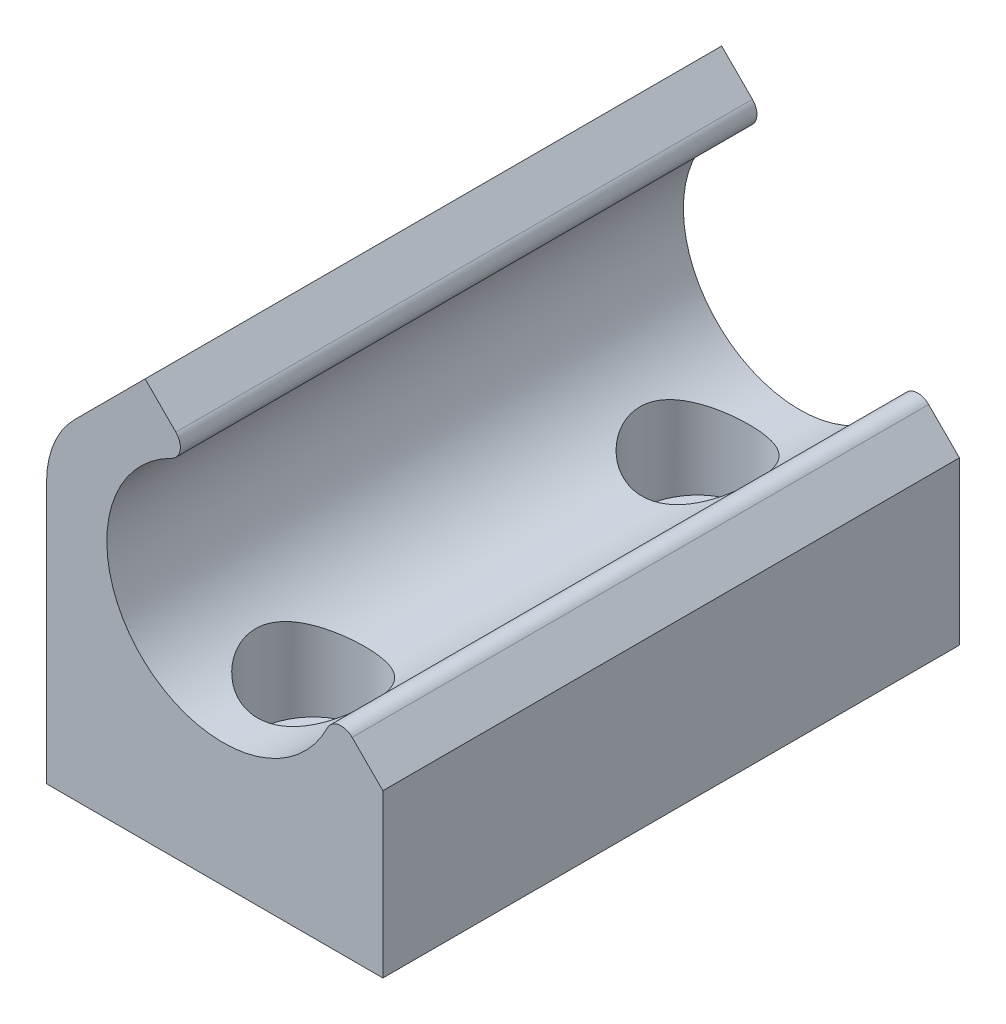
ISO-10303-21;
HEADER;
FILE_DESCRIPTION(('STEP AP214'),'2;1');
FILE_NAME('part.step','',(''),(''),'','','');
FILE_SCHEMA(('AUTOMOTIVE_DESIGN { 1 0 10303 214 1 1 1 1 }'));
ENDSEC;
DATA;
#1=APPLICATION_CONTEXT('core data for automotive mechanical design processes');
#2=APPLICATION_PROTOCOL_DEFINITION('international standard','automotive_design',2000,#1);
#3=PRODUCT_CONTEXT('',#1,'mechanical');
#4=PRODUCT('Part','Part','',(#3));
#5=PRODUCT_RELATED_PRODUCT_CATEGORY('part','',(#4));
#6=PRODUCT_DEFINITION_FORMATION('','',#4);
#7=PRODUCT_DEFINITION_CONTEXT('part definition',#1,'design');
#8=PRODUCT_DEFINITION('design','',#6,#7);
#9=PRODUCT_DEFINITION_SHAPE('','',#8);
#10=(LENGTH_UNIT() NAMED_UNIT(*) SI_UNIT(.MILLI.,.METRE.));
#11=(NAMED_UNIT(*) PLANE_ANGLE_UNIT() SI_UNIT($,.RADIAN.));
#12=(NAMED_UNIT(*) SI_UNIT($,.STERADIAN.) SOLID_ANGLE_UNIT());
#13=UNCERTAINTY_MEASURE_WITH_UNIT(LENGTH_MEASURE(1.E-05),#10,'distance_accuracy_value','');
#14=(GEOMETRIC_REPRESENTATION_CONTEXT(3) GLOBAL_UNCERTAINTY_ASSIGNED_CONTEXT((#13)) GLOBAL_UNIT_ASSIGNED_CONTEXT((#10,
#11,#12)) REPRESENTATION_CONTEXT('',''));
#15=CARTESIAN_POINT('',(0.,0.,0.));
#16=DIRECTION('',(0.,0.,1.));
#17=DIRECTION('',(1.,0.,0.));
#18=AXIS2_PLACEMENT_3D('',#15,#16,#17);
#19=CARTESIAN_POINT('',(9.1857781045255,12.4974390727315,30.));
#20=DIRECTION('',(0.,0.,-1.));
#21=DIRECTION('',(-1.,0.,0.));
#22=AXIS2_PLACEMENT_3D('',#19,#20,#21);
#23=CYLINDRICAL_SURFACE('',#22,6.05);
#24=CARTESIAN_POINT('',(9.1857781045255,12.4974390727315,30.));
#25=DIRECTION('',(0.,0.,-1.));
#26=DIRECTION('',(-1.,0.,0.));
#27=AXIS2_PLACEMENT_3D('',#24,#25,#26);
#28=CIRCLE('',#27,6.05);
#29=CARTESIAN_POINT('',(14.6152124653708,9.82840506746424,30.));
#30=VERTEX_POINT('',#29);
#31=CARTESIAN_POINT('',(6.51674409925826,17.9268734335767,30.));
#32=VERTEX_POINT('',#31);
#33=EDGE_CURVE('E212',#30,#32,#28,.T.);
#34=ORIENTED_EDGE('',*,*,#33,.F.);
#35=DIRECTION('',(0.,0.,-1.));
#36=VECTOR('',#35,1.);
#37=CARTESIAN_POINT('',(14.6152124653708,9.82840506746424,30.));
#38=LINE('',#37,#36);
#39=CARTESIAN_POINT('',(14.6152124653708,9.82840506746424,0.));
#40=VERTEX_POINT('',#39);
#41=EDGE_CURVE('E137',#30,#40,#38,.T.);
#42=ORIENTED_EDGE('',*,*,#41,.T.);
#43=CARTESIAN_POINT('',(9.1857781045255,12.4974390727315,0.));
#44=DIRECTION('',(0.,0.,-1.));
#45=DIRECTION('',(-1.,0.,0.));
#46=AXIS2_PLACEMENT_3D('',#43,#44,#45);
#47=CIRCLE('',#46,6.05);
#48=CARTESIAN_POINT('',(6.51674409925826,17.9268734335767,0.));
#49=VERTEX_POINT('',#48);
#50=EDGE_CURVE('E231',#40,#49,#47,.T.);
#51=ORIENTED_EDGE('',*,*,#50,.T.);
#52=DIRECTION('',(0.,0.,-1.));
#53=VECTOR('',#52,1.);
#54=CARTESIAN_POINT('',(6.51674409925826,17.9268734335767,30.));
#55=LINE('',#54,#53);
#56=EDGE_CURVE('E135',#49,#32,#55,.F.);
#57=ORIENTED_EDGE('',*,*,#56,.T.);
#58=EDGE_LOOP('',(#34,#42,#51,#57));
#59=FACE_BOUND('',#58,.T.);
#60=CARTESIAN_POINT('',(8.87549528494813,6.45540095866142,28.));
#61=CARTESIAN_POINT('',(9.03139950122602,6.44740435624747,27.9999884682132));
#62=CARTESIAN_POINT('',(9.18779808214235,6.44547694814391,27.9877768449764));
#63=CARTESIAN_POINT('',(9.49662535559507,6.45344673263324,27.939170372275));
#64=CARTESIAN_POINT('',(9.64904699591284,6.46336364166569,27.9027352443801));
#65=CARTESIAN_POINT('',(9.94496611693315,6.49342498274608,27.8071919153995));
#66=CARTESIAN_POINT('',(10.0884903727129,6.51353687169971,27.7481560034838));
#67=CARTESIAN_POINT('',(10.3636691682537,6.56156402023977,27.6094261179907));
#68=CARTESIAN_POINT('',(10.4953240499643,6.5894790549271,27.5297327397992));
#69=CARTESIAN_POINT('',(10.7502788587051,6.65168073659721,27.3475349797805));
#70=CARTESIAN_POINT('',(10.8728583994436,6.68621169164239,27.2441078185814));
#71=CARTESIAN_POINT('',(11.09984891244,6.75696914277472,27.019354128965));
#72=CARTESIAN_POINT('',(11.2042489267968,6.79319664489608,26.8980168859025));
#73=CARTESIAN_POINT('',(11.3998914951163,6.86610517699903,26.6300252938702));
#74=CARTESIAN_POINT('',(11.4895348563626,6.90261208430558,26.4821485884913));
#75=CARTESIAN_POINT('',(11.642570867745,6.96809560750674,26.1718295053516));
#76=CARTESIAN_POINT('',(11.705973996028,6.99707522744344,26.0093929731479));
#77=CARTESIAN_POINT('',(11.8021735069858,7.04219106759068,25.6803361510441));
#78=CARTESIAN_POINT('',(11.8359836555846,7.05874965271986,25.5140734029774));
#79=CARTESIAN_POINT('',(11.8750191615476,7.07793758194683,25.1774857684325));
#80=CARTESIAN_POINT('',(11.8802668062833,7.08057778653051,25.0071641533644));
#81=CARTESIAN_POINT('',(11.8628181806249,7.07194410347054,24.6845307256137));
#82=CARTESIAN_POINT('',(11.8427096597932,7.06195848980425,24.5320348069978));
#83=CARTESIAN_POINT('',(11.7797850452715,7.03165161456526,24.2328784775741));
#84=CARTESIAN_POINT('',(11.7369634520435,7.01132784985495,24.0862194893175));
#85=CARTESIAN_POINT('',(11.6294066801047,6.96257784291409,23.8001301326586));
#86=CARTESIAN_POINT('',(11.5643565085781,6.93403611706231,23.6608389008156));
#87=CARTESIAN_POINT('',(11.4143686578002,6.87227669636158,23.3945404094432));
#88=CARTESIAN_POINT('',(11.3294224796463,6.83905700566895,23.2675384323227));
#89=CARTESIAN_POINT('',(11.1321835410953,6.76803884667236,23.0162369263696));
#90=CARTESIAN_POINT('',(11.0180211402644,6.73011170622754,22.8934362407789));
#91=CARTESIAN_POINT('',(10.7703027638599,6.65719569775622,22.6681023647629));
#92=CARTESIAN_POINT('',(10.6367412657133,6.62220767093421,22.5655749654693));
#93=CARTESIAN_POINT('',(10.3495689921729,6.5585656625862,22.3814335797287));
#94=CARTESIAN_POINT('',(10.1955448033763,6.53008928656067,22.3003980892383));
#95=CARTESIAN_POINT('',(9.87436477748037,6.48457200110711,22.1658315230099));
#96=CARTESIAN_POINT('',(9.70721906756909,6.46752236759392,22.1122794715607));
#97=CARTESIAN_POINT('',(9.37916590008335,6.44848132739527,22.0381974626905));
#98=CARTESIAN_POINT('',(9.21884562249271,6.44538452891219,22.0153489461199));
#99=CARTESIAN_POINT('',(8.89691648037471,6.4521976626231,21.9957495066285));
#100=CARTESIAN_POINT('',(8.73530804581879,6.46210342170024,21.9989902121935));
#101=CARTESIAN_POINT('',(8.42541232444363,6.49350730342819,22.03010813462));
#102=CARTESIAN_POINT('',(8.27690059816906,6.51428933887078,22.056525112841));
#103=CARTESIAN_POINT('',(7.98707655238687,6.56555164683525,22.1306622206776));
#104=CARTESIAN_POINT('',(7.84576543698287,6.59603353525585,22.1783859003115));
#105=CARTESIAN_POINT('',(7.56697382975104,6.66617884046379,22.2959802836046));
#106=CARTESIAN_POINT('',(7.42997784087949,6.70620359865459,22.3667784978471));
#107=CARTESIAN_POINT('',(7.16956518845382,6.79163507559249,22.5275013347356));
#108=CARTESIAN_POINT('',(7.04615506229741,6.83704436368767,22.6174351047282));
#109=CARTESIAN_POINT('',(6.80229039905101,6.93501560243133,22.82510855536));
#110=CARTESIAN_POINT('',(6.68359123576775,6.98782068093557,22.9448013555173));
#111=CARTESIAN_POINT('',(6.46736656834592,7.09122710993321,23.2029657019698));
#112=CARTESIAN_POINT('',(6.3698587683695,7.14182658978099,23.3414527941189));
#113=CARTESIAN_POINT('',(6.19494795202944,7.23741776699546,23.6413398023546));
#114=CARTESIAN_POINT('',(6.11857926206208,7.2820784294398,23.8034648394267));
#115=CARTESIAN_POINT('',(6.02617872039569,7.33791204694234,24.0568649344285));
#116=CARTESIAN_POINT('',(5.99907408067541,7.35466128009003,24.1430140441605));
#117=CARTESIAN_POINT('',(5.95261318254559,7.38374170477447,24.3181288589389));
#118=CARTESIAN_POINT('',(5.9332552371456,7.39607385815311,24.4070939461937));
#119=CARTESIAN_POINT('',(5.90457256610746,7.41448306829454,24.5757365720437));
#120=CARTESIAN_POINT('',(5.89429824134949,7.42114804847093,24.6551901540139));
#121=CARTESIAN_POINT('',(5.88013863406065,7.43035706295575,24.814898591548));
#122=CARTESIAN_POINT('',(5.87625250893076,7.4329016407417,24.8951533400336));
#123=CARTESIAN_POINT('',(5.87493923433004,7.43375976439539,25.0557137543537));
#124=CARTESIAN_POINT('',(5.87750981964802,7.43207479411788,25.1360193924524));
#125=CARTESIAN_POINT('',(5.88905071700072,7.42455734069398,25.2959495605022));
#126=CARTESIAN_POINT('',(5.89802074755596,7.41872503996786,25.3755741202548));
#127=CARTESIAN_POINT('',(5.9315876511128,7.39710218152119,25.5944743643302));
#128=CARTESIAN_POINT('',(5.96290174999751,7.3771001838947,25.7323706845501));
#129=CARTESIAN_POINT('',(6.0438194705235,7.32706003019278,26.000652593341));
#130=CARTESIAN_POINT('',(6.09342921786011,7.29701851303135,26.1310356494178));
#131=CARTESIAN_POINT('',(6.2140911613304,7.2270670027082,26.3926050806416));
#132=CARTESIAN_POINT('',(6.28657939839812,7.18654559224073,26.5229629488515));
#133=CARTESIAN_POINT('',(6.44915917513535,7.10097248772729,26.7705530207602));
#134=CARTESIAN_POINT('',(6.53926060567717,7.05591825515936,26.8877777909743));
#135=CARTESIAN_POINT('',(6.75022416905689,6.95793928049711,27.1241368962574));
#136=CARTESIAN_POINT('',(6.87367521154988,6.9048508984646,27.2409012101503));
#137=CARTESIAN_POINT('',(7.1396155368062,6.80217882073999,27.452668857923));
#138=CARTESIAN_POINT('',(7.2821189939908,6.75259777680563,27.5476558458985));
#139=CARTESIAN_POINT('',(7.5099657180754,6.68359872877432,27.6726669562825));
#140=CARTESIAN_POINT('',(7.58950715245339,6.66121526915528,27.7118533633208));
#141=CARTESIAN_POINT('',(7.75232825978302,6.61910817244812,27.7832327540107));
#142=CARTESIAN_POINT('',(7.83560609394893,6.59938324575075,27.8154291330698));
#143=CARTESIAN_POINT('',(8.00512817653033,6.56312656790203,27.8723578620836));
#144=CARTESIAN_POINT('',(8.09136521832527,6.54658762931149,27.8971070851428));
#145=CARTESIAN_POINT('',(8.26624523273616,6.51707002149458,27.9388582892593));
#146=CARTESIAN_POINT('',(8.35488665526586,6.50408911569059,27.9558651416315));
#147=CARTESIAN_POINT('',(8.51546118610677,6.48426102242456,27.9791843209241));
#148=CARTESIAN_POINT('',(8.58709447263674,6.47670195062564,27.9869742880269));
#149=CARTESIAN_POINT('',(8.73094810635742,6.46412670788961,27.9973849958789));
#150=CARTESIAN_POINT('',(8.80316849707305,6.45911072726373,28.0000053498046));
#151=CARTESIAN_POINT('',(8.87549528494813,6.45540095866142,28.));
#152=B_SPLINE_CURVE_WITH_KNOTS('',3,(#60,#61,#62,#63,#64,#65,#66,#67,#68,#69,#70,#71,#72,#73,
#74,#75,#76,#77,#78,#79,#80,#81,#82,#83,#84,#85,#86,#87,#88,#89,#90,#91,#92,#93,#94,#95,#96,#97,
#98,#99,#100,#101,#102,#103,#104,#105,#106,#107,#108,#109,#110,#111,#112,#113,#114,#115,#116,
#117,#118,#119,#120,#121,#122,#123,#124,#125,#126,#127,#128,#129,#130,#131,#132,#133,#134,#135,
#136,#137,#138,#139,#140,#141,#142,#143,#144,#145,#146,#147,#148,#149,#150,#151),.UNSPECIFIED.,
.T.,.F.,(4,2,2,2,2,2,2,2,2,2,2,2,2,2,2,2,2,2,2,2,2,2,2,2,2,2,2,2,2,2,2,2,2,2,2,2,2,2,2,2,2,2,2,
2,2,4),(0.,0.468051519431486,0.936883259942433,1.40422779275271,1.87155885733728,
2.36167663777967,2.85208882689792,3.37970829950646,3.90711688141939,4.41565830874937,
4.92380286337145,5.38404252648297,5.84439367877282,6.31155917403817,6.77892459176479,
7.29233304118356,7.80588793624416,8.33211545302118,8.85794074673161,9.34127944264786,
9.82446305093993,10.2792275979235,10.7340679438385,11.2100805728486,11.6863212628887,
12.2139430832411,12.7420040210141,13.2925772538213,13.5677452144805,13.8428532194166,
14.0836830237557,14.3244810602639,14.5651946292688,14.805897611145,15.2323284284896,
15.6589021519645,16.1208194904601,16.5829969725004,17.1147631823857,17.6469272348777,
17.9209644880393,18.1948683282359,18.4681468258848,18.7412531447837,18.9583744708216,
19.1755120426509),.UNSPECIFIED.);
#153=CARTESIAN_POINT('',(8.87549528494813,6.45540095866142,28.));
#154=VERTEX_POINT('',#153);
#155=EDGE_CURVE('E159',#154,#154,#152,.T.);
#156=ORIENTED_EDGE('',*,*,#155,.F.);
#157=EDGE_LOOP('',(#156));
#158=FACE_BOUND('',#157,.T.);
#159=CARTESIAN_POINT('',(8.87549528494813,6.45540095866142,8.));
#160=CARTESIAN_POINT('',(9.03139950122602,6.44740435624747,7.99998846821321));
#161=CARTESIAN_POINT('',(9.18779808214235,6.44547694814391,7.98777684497635));
#162=CARTESIAN_POINT('',(9.49662535559507,6.45344673263324,7.93917037227496));
#163=CARTESIAN_POINT('',(9.64904699591284,6.46336364166569,7.9027352443801));
#164=CARTESIAN_POINT('',(9.94496611693315,6.49342498274608,7.80719191539948));
#165=CARTESIAN_POINT('',(10.0884903727129,6.51353687169971,7.74815600348381));
#166=CARTESIAN_POINT('',(10.3636691682537,6.56156402023977,7.6094261179907));
#167=CARTESIAN_POINT('',(10.4953240499643,6.5894790549271,7.52973273979915));
#168=CARTESIAN_POINT('',(10.7502788587051,6.65168073659721,7.34753497978051));
#169=CARTESIAN_POINT('',(10.8728583994436,6.68621169164239,7.24410781858141));
#170=CARTESIAN_POINT('',(11.09984891244,6.75696914277472,7.01935412896496));
#171=CARTESIAN_POINT('',(11.2042489267968,6.79319664489608,6.89801688590247));
#172=CARTESIAN_POINT('',(11.3998914951163,6.86610517699903,6.63002529387015));
#173=CARTESIAN_POINT('',(11.4895348563626,6.90261208430558,6.48214858849132));
#174=CARTESIAN_POINT('',(11.642570867745,6.96809560750674,6.17182950535158));
#175=CARTESIAN_POINT('',(11.705973996028,6.99707522744344,6.00939297314791));
#176=CARTESIAN_POINT('',(11.8021735069858,7.04219106759068,5.68033615104408));
#177=CARTESIAN_POINT('',(11.8359836555846,7.05874965271986,5.51407340297739));
#178=CARTESIAN_POINT('',(11.8750191615476,7.07793758194683,5.17748576843248));
#179=CARTESIAN_POINT('',(11.8802668062833,7.08057778653051,5.0071641533644));
#180=CARTESIAN_POINT('',(11.8628181806249,7.07194410347054,4.68453072561368));
#181=CARTESIAN_POINT('',(11.8427096597932,7.06195848980425,4.53203480699778));
#182=CARTESIAN_POINT('',(11.7797850452715,7.03165161456526,4.23287847757408));
#183=CARTESIAN_POINT('',(11.7369634520435,7.01132784985495,4.08621948931746));
#184=CARTESIAN_POINT('',(11.6294066801047,6.96257784291409,3.80013013265858));
#185=CARTESIAN_POINT('',(11.5643565085781,6.93403611706231,3.66083890081561));
#186=CARTESIAN_POINT('',(11.4143686578002,6.87227669636158,3.39454040944315));
#187=CARTESIAN_POINT('',(11.3294224796463,6.83905700566895,3.2675384323227));
#188=CARTESIAN_POINT('',(11.1321835410953,6.76803884667236,3.01623692636957));
#189=CARTESIAN_POINT('',(11.0180211402644,6.73011170622754,2.89343624077893));
#190=CARTESIAN_POINT('',(10.7703027638599,6.65719569775622,2.66810236476289));
#191=CARTESIAN_POINT('',(10.6367412657133,6.62220767093421,2.56557496546932));
#192=CARTESIAN_POINT('',(10.3495689921729,6.5585656625862,2.38143357972874));
#193=CARTESIAN_POINT('',(10.1955448033763,6.53008928656067,2.30039808923825));
#194=CARTESIAN_POINT('',(9.87436477748037,6.48457200110711,2.16583152300988));
#195=CARTESIAN_POINT('',(9.70721906756909,6.46752236759392,2.11227947156065));
#196=CARTESIAN_POINT('',(9.37916590008335,6.44848132739527,2.03819746269052));
#197=CARTESIAN_POINT('',(9.21884562249271,6.44538452891219,2.01534894611987));
#198=CARTESIAN_POINT('',(8.89691648037471,6.4521976626231,1.99574950662849));
#199=CARTESIAN_POINT('',(8.73530804581879,6.46210342170024,1.99899021219348));
#200=CARTESIAN_POINT('',(8.42541232444363,6.49350730342819,2.03010813462003));
#201=CARTESIAN_POINT('',(8.27690059816906,6.51428933887078,2.05652511284096));
#202=CARTESIAN_POINT('',(7.98707655238687,6.56555164683525,2.13066222067764));
#203=CARTESIAN_POINT('',(7.84576543698287,6.59603353525585,2.17838590031148));
#204=CARTESIAN_POINT('',(7.56697382975105,6.66617884046379,2.29598028360457));
#205=CARTESIAN_POINT('',(7.4299778408795,6.70620359865459,2.36677849784712));
#206=CARTESIAN_POINT('',(7.16956518845382,6.79163507559249,2.52750133473555));
#207=CARTESIAN_POINT('',(7.04615506229741,6.83704436368767,2.6174351047282));
#208=CARTESIAN_POINT('',(6.80229039905101,6.93501560243132,2.82510855536));
#209=CARTESIAN_POINT('',(6.68359123576775,6.98782068093557,2.94480135551732));
#210=CARTESIAN_POINT('',(6.46736656834592,7.09122710993321,3.20296570196979));
#211=CARTESIAN_POINT('',(6.3698587683695,7.14182658978099,3.34145279411889));
#212=CARTESIAN_POINT('',(6.19494795202944,7.23741776699546,3.64133980235455));
#213=CARTESIAN_POINT('',(6.11857926206208,7.2820784294398,3.8034648394267));
#214=CARTESIAN_POINT('',(6.02617872039569,7.33791204694234,4.05686493442845));
#215=CARTESIAN_POINT('',(5.99907408067541,7.35466128009003,4.14301404416052));
#216=CARTESIAN_POINT('',(5.95261318254559,7.38374170477447,4.31812885893888));
#217=CARTESIAN_POINT('',(5.93325523714561,7.39607385815311,4.40709394619366));
#218=CARTESIAN_POINT('',(5.90457256610746,7.41448306829454,4.57573657204369));
#219=CARTESIAN_POINT('',(5.89429824134949,7.42114804847093,4.65519015401389));
#220=CARTESIAN_POINT('',(5.88013863406065,7.43035706295575,4.81489859154804));
#221=CARTESIAN_POINT('',(5.87625250893076,7.4329016407417,4.89515334003358));
#222=CARTESIAN_POINT('',(5.87493923433004,7.43375976439539,5.05571375435375));
#223=CARTESIAN_POINT('',(5.87750981964802,7.43207479411788,5.13601939245235));
#224=CARTESIAN_POINT('',(5.88905071700072,7.42455734069398,5.29594956050222));
#225=CARTESIAN_POINT('',(5.89802074755596,7.41872503996786,5.37557412025482));
#226=CARTESIAN_POINT('',(5.9315876511128,7.3971021815212,5.59447436433022));
#227=CARTESIAN_POINT('',(5.96290174999751,7.3771001838947,5.73237068455012));
#228=CARTESIAN_POINT('',(6.0438194705235,7.32706003019278,6.00065259334102));
#229=CARTESIAN_POINT('',(6.0934292178601,7.29701851303135,6.1310356494178));
#230=CARTESIAN_POINT('',(6.2140911613304,7.2270670027082,6.39260508064161));
#231=CARTESIAN_POINT('',(6.28657939839812,7.18654559224073,6.52296294885154));
#232=CARTESIAN_POINT('',(6.44915917513535,7.10097248772729,6.77055302076015));
#233=CARTESIAN_POINT('',(6.53926060567717,7.05591825515936,6.88777779097431));
#234=CARTESIAN_POINT('',(6.75022416905689,6.95793928049711,7.12413689625742));
#235=CARTESIAN_POINT('',(6.87367521154988,6.9048508984646,7.24090121015031));
#236=CARTESIAN_POINT('',(7.1396155368062,6.80217882074,7.45266885792299));
#237=CARTESIAN_POINT('',(7.2821189939908,6.75259777680563,7.54765584589848));
#238=CARTESIAN_POINT('',(7.5099657180754,6.68359872877432,7.6726669562825));
#239=CARTESIAN_POINT('',(7.58950715245339,6.66121526915527,7.7118533633208));
#240=CARTESIAN_POINT('',(7.75232825978302,6.61910817244812,7.78323275401069));
#241=CARTESIAN_POINT('',(7.83560609394893,6.59938324575075,7.8154291330698));
#242=CARTESIAN_POINT('',(8.00512817653033,6.56312656790203,7.87235786208361));
#243=CARTESIAN_POINT('',(8.09136521832527,6.54658762931149,7.89710708514279));
#244=CARTESIAN_POINT('',(8.26624523273616,6.51707002149458,7.93885828925927));
#245=CARTESIAN_POINT('',(8.35488665526586,6.50408911569059,7.95586514163149));
#246=CARTESIAN_POINT('',(8.51546118610677,6.48426102242456,7.97918432092407));
#247=CARTESIAN_POINT('',(8.58709447263674,6.47670195062564,7.98697428802689));
#248=CARTESIAN_POINT('',(8.73094810635742,6.46412670788961,7.99738499587894));
#249=CARTESIAN_POINT('',(8.80316849707305,6.45911072726373,8.00000534980462));
#250=CARTESIAN_POINT('',(8.87549528494813,6.45540095866142,8.));
#251=B_SPLINE_CURVE_WITH_KNOTS('',3,(#159,#160,#161,#162,#163,#164,#165,#166,#167,#168,#169,
#170,#171,#172,#173,#174,#175,#176,#177,#178,#179,#180,#181,#182,#183,#184,#185,#186,#187,#188,
#189,#190,#191,#192,#193,#194,#195,#196,#197,#198,#199,#200,#201,#202,#203,#204,#205,#206,#207,
#208,#209,#210,#211,#212,#213,#214,#215,#216,#217,#218,#219,#220,#221,#222,#223,#224,#225,#226,
#227,#228,#229,#230,#231,#232,#233,#234,#235,#236,#237,#238,#239,#240,#241,#242,#243,#244,#245,
#246,#247,#248,#249,#250),.UNSPECIFIED.,.T.,.F.,(4,2,2,2,2,2,2,2,2,2,2,2,2,2,2,2,2,2,2,2,2,2,2,
2,2,2,2,2,2,2,2,2,2,2,2,2,2,2,2,2,2,2,2,2,2,4),(0.,0.468051519431484,0.936883259942432,
1.40422779275271,1.87155885733728,2.36167663777967,2.85208882689792,3.37970829950646,
3.90711688141939,4.41565830874937,4.92380286337144,5.38404252648297,5.84439367877282,
6.31155917403817,6.77892459176479,7.29233304118356,7.80588793624416,8.33211545302118,
8.85794074673161,9.34127944264786,9.82446305093993,10.2792275979235,10.7340679438385,
11.2100805728486,11.6863212628887,12.2139430832411,12.7420040210141,13.2925772538213,
13.5677452144805,13.8428532194166,14.0836830237557,14.3244810602639,14.5651946292688,
14.805897611145,15.2323284284895,15.6589021519645,16.1208194904601,16.5829969725004,
17.1147631823857,17.6469272348777,17.9209644880393,18.1948683282359,18.4681468258848,
18.7412531447837,18.9583744708216,19.1755120426509),.UNSPECIFIED.);
#252=CARTESIAN_POINT('',(8.87549528494813,6.45540095866142,8.));
#253=VERTEX_POINT('',#252);
#254=EDGE_CURVE('E167',#253,#253,#251,.T.);
#255=ORIENTED_EDGE('',*,*,#254,.F.);
#256=EDGE_LOOP('',(#255));
#257=FACE_BOUND('',#256,.T.);
#258=ADVANCED_FACE('F35',(#59,#158,#257),#23,.F.);
#259=CARTESIAN_POINT('',(0.,15.6833219364119,30.));
#260=DIRECTION('',(1.,0.,0.));
#261=DIRECTION('',(0.,1.,0.));
#262=AXIS2_PLACEMENT_3D('',#259,#260,#261);
#263=PLANE('',#262);
#264=DIRECTION('',(0.,-1.,0.));
#265=VECTOR('',#264,1.);
#266=CARTESIAN_POINT('',(0.,15.6833219364119,30.));
#267=LINE('',#266,#265);
#268=CARTESIAN_POINT('',(0.,13.6122541245465,30.));
#269=VERTEX_POINT('',#268);
#270=CARTESIAN_POINT('',(0.,0.,30.));
#271=VERTEX_POINT('',#270);
#272=EDGE_CURVE('E111',#269,#271,#267,.T.);
#273=ORIENTED_EDGE('',*,*,#272,.F.);
#274=DIRECTION('',(0.,0.,-1.));
#275=VECTOR('',#274,1.);
#276=CARTESIAN_POINT('',(0.,13.6122541245465,30.));
#277=LINE('',#276,#275);
#278=CARTESIAN_POINT('',(0.,13.6122541245465,0.));
#279=VERTEX_POINT('',#278);
#280=EDGE_CURVE('E158',#269,#279,#277,.T.);
#281=ORIENTED_EDGE('',*,*,#280,.T.);
#282=DIRECTION('',(0.,-1.,0.));
#283=VECTOR('',#282,1.);
#284=CARTESIAN_POINT('',(0.,15.6833219364119,0.));
#285=LINE('',#284,#283);
#286=CARTESIAN_POINT('',(0.,0.,0.));
#287=VERTEX_POINT('',#286);
#288=EDGE_CURVE('E133',#279,#287,#285,.T.);
#289=ORIENTED_EDGE('',*,*,#288,.T.);
#290=DIRECTION('',(0.,0.,-1.));
#291=VECTOR('',#290,1.);
#292=CARTESIAN_POINT('',(0.,0.,30.));
#293=LINE('',#292,#291);
#294=EDGE_CURVE('E126',#271,#287,#293,.T.);
#295=ORIENTED_EDGE('',*,*,#294,.F.);
#296=EDGE_LOOP('',(#273,#281,#289,#295));
#297=FACE_BOUND('',#296,.T.);
#298=ADVANCED_FACE('F132',(#297),#263,.F.);
#299=CARTESIAN_POINT('',(0.,0.,30.));
#300=DIRECTION('',(0.,1.,0.));
#301=DIRECTION('',(0.,0.,1.));
#302=AXIS2_PLACEMENT_3D('',#299,#300,#301);
#303=PLANE('',#302);
#304=CARTESIAN_POINT('',(8.87549528494813,0.,5.));
#305=DIRECTION('',(0.,-1.,0.));
#306=DIRECTION('',(0.,0.,-1.));
#307=AXIS2_PLACEMENT_3D('',#304,#305,#306);
#308=CIRCLE('',#307,1.55);
#309=CARTESIAN_POINT('',(8.87549528494813,0.,3.45));
#310=VERTEX_POINT('',#309);
#311=EDGE_CURVE('E271',#310,#310,#308,.T.);
#312=ORIENTED_EDGE('',*,*,#311,.F.);
#313=EDGE_LOOP('',(#312));
#314=FACE_BOUND('',#313,.T.);
#315=CARTESIAN_POINT('',(8.87549528494813,0.,25.));
#316=DIRECTION('',(0.,-1.,0.));
#317=DIRECTION('',(0.,0.,-1.));
#318=AXIS2_PLACEMENT_3D('',#315,#316,#317);
#319=CIRCLE('',#318,1.55);
#320=CARTESIAN_POINT('',(8.87549528494813,0.,23.45));
#321=VERTEX_POINT('',#320);
#322=EDGE_CURVE('E268',#321,#321,#319,.T.);
#323=ORIENTED_EDGE('',*,*,#322,.F.);
#324=EDGE_LOOP('',(#323));
#325=FACE_BOUND('',#324,.T.);
#326=DIRECTION('',(1.,0.,0.));
#327=VECTOR('',#326,1.);
#328=CARTESIAN_POINT('',(0.,0.,0.));
#329=LINE('',#328,#327);
#330=CARTESIAN_POINT('',(17.5,0.,0.));
#331=VERTEX_POINT('',#330);
#332=EDGE_CURVE('E219',#287,#331,#329,.T.);
#333=ORIENTED_EDGE('',*,*,#332,.T.);
#334=DIRECTION('',(0.,0.,-1.));
#335=VECTOR('',#334,1.);
#336=CARTESIAN_POINT('',(17.5,0.,30.));
#337=LINE('',#336,#335);
#338=CARTESIAN_POINT('',(17.5,0.,30.));
#339=VERTEX_POINT('',#338);
#340=EDGE_CURVE('E128',#339,#331,#337,.T.);
#341=ORIENTED_EDGE('',*,*,#340,.F.);
#342=DIRECTION('',(1.,0.,0.));
#343=VECTOR('',#342,1.);
#344=CARTESIAN_POINT('',(0.,0.,30.));
#345=LINE('',#344,#343);
#346=EDGE_CURVE('E114',#271,#339,#345,.T.);
#347=ORIENTED_EDGE('',*,*,#346,.F.);
#348=ORIENTED_EDGE('',*,*,#294,.T.);
#349=EDGE_LOOP('',(#333,#341,#347,#348));
#350=FACE_BOUND('',#349,.T.);
#351=ADVANCED_FACE('F125',(#314,#325,#350),#303,.F.);
#352=CARTESIAN_POINT('',(17.5,0.,30.));
#353=DIRECTION('',(-1.,0.,0.));
#354=DIRECTION('',(0.,0.,1.));
#355=AXIS2_PLACEMENT_3D('',#352,#353,#354);
#356=PLANE('',#355);
#357=DIRECTION('',(0.,1.,0.));
#358=VECTOR('',#357,1.);
#359=CARTESIAN_POINT('',(17.5,0.,0.));
#360=LINE('',#359,#358);
#361=CARTESIAN_POINT('',(17.5,8.44,0.));
#362=VERTEX_POINT('',#361);
#363=EDGE_CURVE('E221',#331,#362,#360,.T.);
#364=ORIENTED_EDGE('',*,*,#363,.T.);
#365=DIRECTION('',(0.,0.,-1.));
#366=VECTOR('',#365,1.);
#367=CARTESIAN_POINT('',(17.5,8.44,30.));
#368=LINE('',#367,#366);
#369=CARTESIAN_POINT('',(17.5,8.44,30.));
#370=VERTEX_POINT('',#369);
#371=EDGE_CURVE('E139',#370,#362,#368,.T.);
#372=ORIENTED_EDGE('',*,*,#371,.F.);
#373=DIRECTION('',(0.,1.,0.));
#374=VECTOR('',#373,1.);
#375=CARTESIAN_POINT('',(17.5,0.,30.));
#376=LINE('',#375,#374);
#377=EDGE_CURVE('E130',#339,#370,#376,.T.);
#378=ORIENTED_EDGE('',*,*,#377,.F.);
#379=ORIENTED_EDGE('',*,*,#340,.T.);
#380=EDGE_LOOP('',(#364,#372,#378,#379));
#381=FACE_BOUND('',#380,.T.);
#382=ADVANCED_FACE('F200',(#381),#356,.F.);
#383=CARTESIAN_POINT('',(17.5,8.44,30.));
#384=DIRECTION('',(-0.707106781186546,-0.707106781186549,0.));
#385=DIRECTION('',(0.707106781186549,-0.707106781186546,0.));
#386=AXIS2_PLACEMENT_3D('',#383,#384,#385);
#387=PLANE('',#386);
#388=DIRECTION('',(-0.707106781186549,0.707106781186546,0.));
#389=VECTOR('',#388,1.);
#390=CARTESIAN_POINT('',(17.5,8.44,0.));
#391=LINE('',#390,#389);
#392=CARTESIAN_POINT('',(15.8988396239855,10.0411603760145,0.));
#393=VERTEX_POINT('',#392);
#394=EDGE_CURVE('E228',#362,#393,#391,.T.);
#395=ORIENTED_EDGE('',*,*,#394,.T.);
#396=DIRECTION('',(0.,0.,-1.));
#397=VECTOR('',#396,1.);
#398=CARTESIAN_POINT('',(15.8988396239855,10.0411603760145,30.));
#399=LINE('',#398,#397);
#400=CARTESIAN_POINT('',(15.8988396239855,10.0411603760145,30.));
#401=VERTEX_POINT('',#400);
#402=EDGE_CURVE('E149',#393,#401,#399,.F.);
#403=ORIENTED_EDGE('',*,*,#402,.T.);
#404=DIRECTION('',(-0.707106781186549,0.707106781186546,0.));
#405=VECTOR('',#404,1.);
#406=CARTESIAN_POINT('',(17.5,8.44,30.));
#407=LINE('',#406,#405);
#408=EDGE_CURVE('E245',#370,#401,#407,.T.);
#409=ORIENTED_EDGE('',*,*,#408,.F.);
#410=ORIENTED_EDGE('',*,*,#371,.T.);
#411=EDGE_LOOP('',(#395,#403,#409,#410));
#412=FACE_BOUND('',#411,.T.);
#413=ADVANCED_FACE('F195',(#412),#387,.F.);
#414=CARTESIAN_POINT('',(7.60321276594693,18.336787234053,30.));
#415=DIRECTION('',(-0.707106781186547,-0.707106781186548,0.));
#416=DIRECTION('',(0.707106781186548,-0.707106781186547,0.));
#417=AXIS2_PLACEMENT_3D('',#414,#415,#416);
#418=PLANE('',#417);
#419=DIRECTION('',(-0.707106781186548,0.707106781186547,0.));
#420=VECTOR('',#419,1.);
#421=CARTESIAN_POINT('',(7.60321276594693,18.336787234053,30.));
#422=LINE('',#421,#420);
#423=CARTESIAN_POINT('',(6.72949940780853,19.2105005921915,30.));
#424=VERTEX_POINT('',#423);
#425=CARTESIAN_POINT('',(5.12833903179401,20.811660968206,30.));
#426=VERTEX_POINT('',#425);
#427=EDGE_CURVE('E255',#424,#426,#422,.T.);
#428=ORIENTED_EDGE('',*,*,#427,.F.);
#429=DIRECTION('',(0.,0.,-1.));
#430=VECTOR('',#429,1.);
#431=CARTESIAN_POINT('',(6.72949940780852,19.2105005921915,30.));
#432=LINE('',#431,#430);
#433=CARTESIAN_POINT('',(6.72949940780853,19.2105005921915,0.));
#434=VERTEX_POINT('',#433);
#435=EDGE_CURVE('E155',#424,#434,#432,.T.);
#436=ORIENTED_EDGE('',*,*,#435,.T.);
#437=DIRECTION('',(-0.707106781186548,0.707106781186547,0.));
#438=VECTOR('',#437,1.);
#439=CARTESIAN_POINT('',(7.60321276594693,18.336787234053,0.));
#440=LINE('',#439,#438);
#441=CARTESIAN_POINT('',(5.12833903179401,20.811660968206,0.));
#442=VERTEX_POINT('',#441);
#443=EDGE_CURVE('E234',#434,#442,#440,.T.);
#444=ORIENTED_EDGE('',*,*,#443,.T.);
#445=DIRECTION('',(0.,0.,-1.));
#446=VECTOR('',#445,1.);
#447=CARTESIAN_POINT('',(5.12833903179401,20.811660968206,30.));
#448=LINE('',#447,#446);
#449=EDGE_CURVE('E237',#426,#442,#448,.T.);
#450=ORIENTED_EDGE('',*,*,#449,.F.);
#451=EDGE_LOOP('',(#428,#436,#444,#450));
#452=FACE_BOUND('',#451,.T.);
#453=ADVANCED_FACE('F193',(#452),#418,.F.);
#454=CARTESIAN_POINT('',(5.12833903179401,20.811660968206,30.));
#455=DIRECTION('',(0.707106781186549,-0.707106781186546,0.));
#456=DIRECTION('',(0.707106781186546,0.707106781186549,0.));
#457=AXIS2_PLACEMENT_3D('',#454,#455,#456);
#458=PLANE('',#457);
#459=DIRECTION('',(-0.707106781186546,-0.707106781186549,0.));
#460=VECTOR('',#459,1.);
#461=CARTESIAN_POINT('',(5.12833903179401,20.811660968206,0.));
#462=LINE('',#461,#460);
#463=CARTESIAN_POINT('',(1.46446609406726,17.1477880304792,0.));
#464=VERTEX_POINT('',#463);
#465=EDGE_CURVE('E121',#442,#464,#462,.T.);
#466=ORIENTED_EDGE('',*,*,#465,.T.);
#467=DIRECTION('',(0.,0.,-1.));
#468=VECTOR('',#467,1.);
#469=CARTESIAN_POINT('',(1.46446609406726,17.1477880304792,30.));
#470=LINE('',#469,#468);
#471=CARTESIAN_POINT('',(1.46446609406726,17.1477880304792,30.));
#472=VERTEX_POINT('',#471);
#473=EDGE_CURVE('E43',#464,#472,#470,.F.);
#474=ORIENTED_EDGE('',*,*,#473,.T.);
#475=DIRECTION('',(-0.707106781186546,-0.707106781186549,0.));
#476=VECTOR('',#475,1.);
#477=CARTESIAN_POINT('',(5.12833903179401,20.811660968206,30.));
#478=LINE('',#477,#476);
#479=EDGE_CURVE('E224',#426,#472,#478,.T.);
#480=ORIENTED_EDGE('',*,*,#479,.F.);
#481=ORIENTED_EDGE('',*,*,#449,.T.);
#482=EDGE_LOOP('',(#466,#474,#480,#481));
#483=FACE_BOUND('',#482,.T.);
#484=ADVANCED_FACE('F188',(#483),#458,.F.);
#485=CARTESIAN_POINT('',(9.1857781045255,12.4974390727315,30.));
#486=DIRECTION('',(0.,0.,-1.));
#487=DIRECTION('',(-1.,0.,0.));
#488=AXIS2_PLACEMENT_3D('',#485,#486,#487);
#489=PLANE('',#488);
#490=ORIENTED_EDGE('',*,*,#479,.T.);
#491=CARTESIAN_POINT('',(5.,13.6122541245465,30.));
#492=DIRECTION('',(0.,0.,-1.));
#493=DIRECTION('',(-1.,0.,0.));
#494=AXIS2_PLACEMENT_3D('',#491,#492,#493);
#495=CIRCLE('',#494,5.);
#496=EDGE_CURVE('E11',#472,#269,#495,.F.);
#497=ORIENTED_EDGE('',*,*,#496,.T.);
#498=ORIENTED_EDGE('',*,*,#272,.T.);
#499=ORIENTED_EDGE('',*,*,#346,.T.);
#500=ORIENTED_EDGE('',*,*,#377,.T.);
#501=ORIENTED_EDGE('',*,*,#408,.T.);
#502=CARTESIAN_POINT('',(15.3331541990363,9.47547495106527,30.));
#503=DIRECTION('',(0.,0.,-1.));
#504=DIRECTION('',(-1.,0.,0.));
#505=AXIS2_PLACEMENT_3D('',#502,#503,#504);
#506=CIRCLE('',#505,0.8);
#507=EDGE_CURVE('E153',#401,#30,#506,.F.);
#508=ORIENTED_EDGE('',*,*,#507,.T.);
#509=ORIENTED_EDGE('',*,*,#33,.T.);
#510=CARTESIAN_POINT('',(6.16381398285929,18.6448151672422,30.));
#511=DIRECTION('',(0.,0.,-1.));
#512=DIRECTION('',(-1.,0.,0.));
#513=AXIS2_PLACEMENT_3D('',#510,#511,#512);
#514=CIRCLE('',#513,0.8);
#515=EDGE_CURVE('E151',#32,#424,#514,.F.);
#516=ORIENTED_EDGE('',*,*,#515,.T.);
#517=ORIENTED_EDGE('',*,*,#427,.T.);
#518=EDGE_LOOP('',(#490,#497,#498,#499,#500,#501,#508,#509,#516,#517));
#519=FACE_BOUND('',#518,.T.);
#520=ADVANCED_FACE('F113',(#519),#489,.F.);
#521=CARTESIAN_POINT('',(9.1857781045255,12.4974390727315,0.));
#522=DIRECTION('',(0.,0.,-1.));
#523=DIRECTION('',(-1.,0.,0.));
#524=AXIS2_PLACEMENT_3D('',#521,#522,#523);
#525=PLANE('',#524);
#526=ORIENTED_EDGE('',*,*,#288,.F.);
#527=CARTESIAN_POINT('',(5.,13.6122541245465,0.));
#528=DIRECTION('',(0.,0.,-1.));
#529=DIRECTION('',(-1.,0.,0.));
#530=AXIS2_PLACEMENT_3D('',#527,#528,#529);
#531=CIRCLE('',#530,5.);
#532=EDGE_CURVE('E57',#279,#464,#531,.T.);
#533=ORIENTED_EDGE('',*,*,#532,.T.);
#534=ORIENTED_EDGE('',*,*,#465,.F.);
#535=ORIENTED_EDGE('',*,*,#443,.F.);
#536=CARTESIAN_POINT('',(6.16381398285929,18.6448151672422,0.));
#537=DIRECTION('',(0.,0.,-1.));
#538=DIRECTION('',(-1.,0.,0.));
#539=AXIS2_PLACEMENT_3D('',#536,#537,#538);
#540=CIRCLE('',#539,0.8);
#541=EDGE_CURVE('E145',#434,#49,#540,.T.);
#542=ORIENTED_EDGE('',*,*,#541,.T.);
#543=ORIENTED_EDGE('',*,*,#50,.F.);
#544=CARTESIAN_POINT('',(15.3331541990363,9.47547495106527,0.));
#545=DIRECTION('',(0.,0.,-1.));
#546=DIRECTION('',(-1.,0.,0.));
#547=AXIS2_PLACEMENT_3D('',#544,#545,#546);
#548=CIRCLE('',#547,0.8);
#549=EDGE_CURVE('E147',#40,#393,#548,.T.);
#550=ORIENTED_EDGE('',*,*,#549,.T.);
#551=ORIENTED_EDGE('',*,*,#394,.F.);
#552=ORIENTED_EDGE('',*,*,#363,.F.);
#553=ORIENTED_EDGE('',*,*,#332,.F.);
#554=EDGE_LOOP('',(#526,#533,#534,#535,#542,#543,#550,#551,#552,#553));
#555=FACE_BOUND('',#554,.T.);
#556=ADVANCED_FACE('F187',(#555),#525,.T.);
#557=CARTESIAN_POINT('',(15.3331541990363,9.47547495106527,30.));
#558=DIRECTION('',(0.,0.,-1.));
#559=DIRECTION('',(-1.,0.,0.));
#560=AXIS2_PLACEMENT_3D('',#557,#558,#559);
#561=CYLINDRICAL_SURFACE('',#560,0.8);
#562=ORIENTED_EDGE('',*,*,#507,.F.);
#563=ORIENTED_EDGE('',*,*,#402,.F.);
#564=ORIENTED_EDGE('',*,*,#549,.F.);
#565=ORIENTED_EDGE('',*,*,#41,.F.);
#566=EDGE_LOOP('',(#562,#563,#564,#565));
#567=FACE_BOUND('',#566,.T.);
#568=ADVANCED_FACE('F191',(#567),#561,.T.);
#569=CARTESIAN_POINT('',(6.16381398285929,18.6448151672422,30.));
#570=DIRECTION('',(0.,0.,-1.));
#571=DIRECTION('',(-1.,0.,0.));
#572=AXIS2_PLACEMENT_3D('',#569,#570,#571);
#573=CYLINDRICAL_SURFACE('',#572,0.8);
#574=ORIENTED_EDGE('',*,*,#515,.F.);
#575=ORIENTED_EDGE('',*,*,#56,.F.);
#576=ORIENTED_EDGE('',*,*,#541,.F.);
#577=ORIENTED_EDGE('',*,*,#435,.F.);
#578=EDGE_LOOP('',(#574,#575,#576,#577));
#579=FACE_BOUND('',#578,.T.);
#580=ADVANCED_FACE('F183',(#579),#573,.T.);
#581=CARTESIAN_POINT('',(8.87549528494813,2.82840506746424,25.));
#582=DIRECTION('',(0.,1.,0.));
#583=DIRECTION('',(0.,0.,1.));
#584=AXIS2_PLACEMENT_3D('',#581,#582,#583);
#585=CYLINDRICAL_SURFACE('',#584,3.);
#586=CARTESIAN_POINT('',(8.87549528494813,2.82840506746424,25.));
#587=DIRECTION('',(0.,-1.,0.));
#588=DIRECTION('',(0.,0.,-1.));
#589=AXIS2_PLACEMENT_3D('',#586,#587,#588);
#590=CIRCLE('',#589,3.);
#591=CARTESIAN_POINT('',(8.87549528494813,2.82840506746424,22.));
#592=VERTEX_POINT('',#591);
#593=EDGE_CURVE('E262',#592,#592,#590,.T.);
#594=ORIENTED_EDGE('',*,*,#593,.T.);
#595=EDGE_LOOP('',(#594));
#596=FACE_BOUND('',#595,.T.);
#597=ORIENTED_EDGE('',*,*,#155,.T.);
#598=EDGE_LOOP('',(#597));
#599=FACE_BOUND('',#598,.T.);
#600=ADVANCED_FACE('F177',(#596,#599),#585,.F.);
#601=CARTESIAN_POINT('',(8.87549528494813,2.82840506746424,25.));
#602=DIRECTION('',(0.,-1.,0.));
#603=DIRECTION('',(0.,0.,-1.));
#604=AXIS2_PLACEMENT_3D('',#601,#602,#603);
#605=PLANE('',#604);
#606=CARTESIAN_POINT('',(8.87549528494813,2.82840506746424,25.));
#607=DIRECTION('',(0.,-1.,0.));
#608=DIRECTION('',(0.,0.,-1.));
#609=AXIS2_PLACEMENT_3D('',#606,#607,#608);
#610=CIRCLE('',#609,1.55);
#611=CARTESIAN_POINT('',(8.87549528494813,2.82840506746424,23.45));
#612=VERTEX_POINT('',#611);
#613=EDGE_CURVE('E265',#612,#612,#610,.F.);
#614=ORIENTED_EDGE('',*,*,#613,.F.);
#615=EDGE_LOOP('',(#614));
#616=FACE_BOUND('',#615,.T.);
#617=ORIENTED_EDGE('',*,*,#593,.F.);
#618=EDGE_LOOP('',(#617));
#619=FACE_BOUND('',#618,.T.);
#620=ADVANCED_FACE('F182',(#616,#619),#605,.F.);
#621=CARTESIAN_POINT('',(8.87549528494813,2.82840506746424,5.));
#622=DIRECTION('',(0.,1.,0.));
#623=DIRECTION('',(0.,0.,1.));
#624=AXIS2_PLACEMENT_3D('',#621,#622,#623);
#625=CYLINDRICAL_SURFACE('',#624,3.);
#626=CARTESIAN_POINT('',(8.87549528494813,2.82840506746424,5.));
#627=DIRECTION('',(0.,-1.,0.));
#628=DIRECTION('',(0.,0.,-1.));
#629=AXIS2_PLACEMENT_3D('',#626,#627,#628);
#630=CIRCLE('',#629,3.);
#631=CARTESIAN_POINT('',(8.87549528494813,2.82840506746424,2.));
#632=VERTEX_POINT('',#631);
#633=EDGE_CURVE('E168',#632,#632,#630,.T.);
#634=ORIENTED_EDGE('',*,*,#633,.T.);
#635=EDGE_LOOP('',(#634));
#636=FACE_BOUND('',#635,.T.);
#637=ORIENTED_EDGE('',*,*,#254,.T.);
#638=EDGE_LOOP('',(#637));
#639=FACE_BOUND('',#638,.T.);
#640=ADVANCED_FACE('F309',(#636,#639),#625,.F.);
#641=CARTESIAN_POINT('',(8.87549528494813,2.82840506746424,5.));
#642=DIRECTION('',(0.,-1.,0.));
#643=DIRECTION('',(0.,0.,-1.));
#644=AXIS2_PLACEMENT_3D('',#641,#642,#643);
#645=PLANE('',#644);
#646=CARTESIAN_POINT('',(8.87549528494813,2.82840506746424,5.));
#647=DIRECTION('',(0.,-1.,0.));
#648=DIRECTION('',(0.,0.,-1.));
#649=AXIS2_PLACEMENT_3D('',#646,#647,#648);
#650=CIRCLE('',#649,1.55);
#651=CARTESIAN_POINT('',(8.87549528494813,2.82840506746424,3.45));
#652=VERTEX_POINT('',#651);
#653=EDGE_CURVE('E273',#652,#652,#650,.F.);
#654=ORIENTED_EDGE('',*,*,#653,.F.);
#655=EDGE_LOOP('',(#654));
#656=FACE_BOUND('',#655,.T.);
#657=ORIENTED_EDGE('',*,*,#633,.F.);
#658=EDGE_LOOP('',(#657));
#659=FACE_BOUND('',#658,.T.);
#660=ADVANCED_FACE('F317',(#656,#659),#645,.F.);
#661=CARTESIAN_POINT('',(8.87549528494813,0.,5.));
#662=DIRECTION('',(0.,1.,0.));
#663=DIRECTION('',(0.,0.,1.));
#664=AXIS2_PLACEMENT_3D('',#661,#662,#663);
#665=CYLINDRICAL_SURFACE('',#664,1.55);
#666=ORIENTED_EDGE('',*,*,#311,.T.);
#667=EDGE_LOOP('',(#666));
#668=FACE_BOUND('',#667,.T.);
#669=ORIENTED_EDGE('',*,*,#653,.T.);
#670=EDGE_LOOP('',(#669));
#671=FACE_BOUND('',#670,.T.);
#672=ADVANCED_FACE('F323',(#668,#671),#665,.F.);
#673=CARTESIAN_POINT('',(8.87549528494813,0.,25.));
#674=DIRECTION('',(0.,1.,0.));
#675=DIRECTION('',(0.,0.,1.));
#676=AXIS2_PLACEMENT_3D('',#673,#674,#675);
#677=CYLINDRICAL_SURFACE('',#676,1.55);
#678=ORIENTED_EDGE('',*,*,#322,.T.);
#679=EDGE_LOOP('',(#678));
#680=FACE_BOUND('',#679,.T.);
#681=ORIENTED_EDGE('',*,*,#613,.T.);
#682=EDGE_LOOP('',(#681));
#683=FACE_BOUND('',#682,.T.);
#684=ADVANCED_FACE('F331',(#680,#683),#677,.F.);
#685=CARTESIAN_POINT('',(5.,13.6122541245465,30.));
#686=DIRECTION('',(0.,0.,-1.));
#687=DIRECTION('',(-1.,0.,0.));
#688=AXIS2_PLACEMENT_3D('',#685,#686,#687);
#689=CYLINDRICAL_SURFACE('',#688,5.);
#690=ORIENTED_EDGE('',*,*,#496,.F.);
#691=ORIENTED_EDGE('',*,*,#473,.F.);
#692=ORIENTED_EDGE('',*,*,#532,.F.);
#693=ORIENTED_EDGE('',*,*,#280,.F.);
#694=EDGE_LOOP('',(#690,#691,#692,#693));
#695=FACE_BOUND('',#694,.T.);
#696=ADVANCED_FACE('F37',(#695),#689,.T.);
#697=CLOSED_SHELL('',(#258,#298,#351,#382,#413,#453,#484,#520,#556,#568,#580,#600,#620,#640,
#660,#672,#684,#696));
#698=MANIFOLD_SOLID_BREP('B2',#697);
#699=ADVANCED_BREP_SHAPE_REPRESENTATION('',(#18,#698),#14);
#700=SHAPE_DEFINITION_REPRESENTATION(#9,#699);
ENDSEC;
END-ISO-10303-21;
